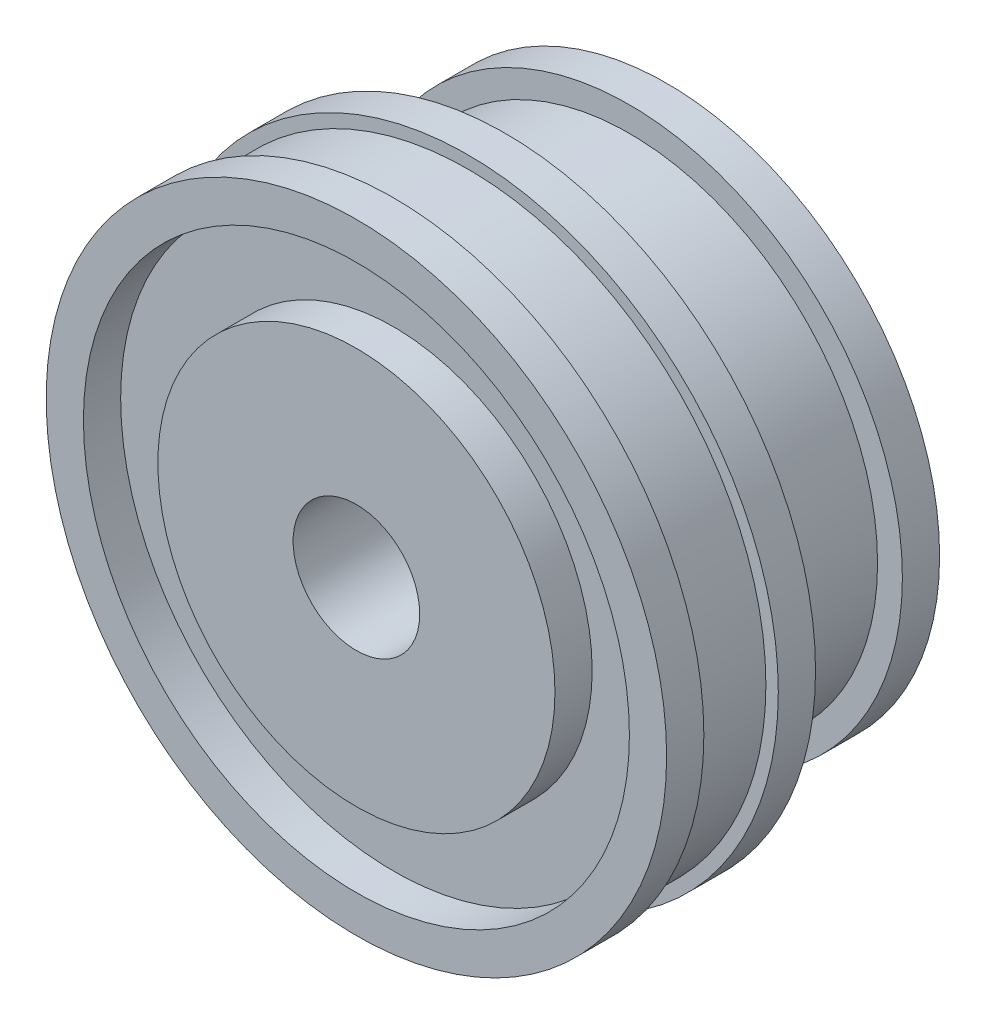
ISO-10303-21;
HEADER;
FILE_DESCRIPTION(('STEP AP214'),'2;1');
FILE_NAME('part.step','',(''),(''),'','','');
FILE_SCHEMA(('AUTOMOTIVE_DESIGN { 1 0 10303 214 1 1 1 1 }'));
ENDSEC;
DATA;
#1=APPLICATION_CONTEXT('core data for automotive mechanical design processes');
#2=APPLICATION_PROTOCOL_DEFINITION('international standard','automotive_design',2000,#1);
#3=PRODUCT_CONTEXT('',#1,'mechanical');
#4=PRODUCT('Part','Part','',(#3));
#5=PRODUCT_RELATED_PRODUCT_CATEGORY('part','',(#4));
#6=PRODUCT_DEFINITION_FORMATION('','',#4);
#7=PRODUCT_DEFINITION_CONTEXT('part definition',#1,'design');
#8=PRODUCT_DEFINITION('design','',#6,#7);
#9=PRODUCT_DEFINITION_SHAPE('','',#8);
#10=(LENGTH_UNIT() NAMED_UNIT(*) SI_UNIT(.MILLI.,.METRE.));
#11=(NAMED_UNIT(*) PLANE_ANGLE_UNIT() SI_UNIT($,.RADIAN.));
#12=(NAMED_UNIT(*) SI_UNIT($,.STERADIAN.) SOLID_ANGLE_UNIT());
#13=UNCERTAINTY_MEASURE_WITH_UNIT(LENGTH_MEASURE(1.E-05),#10,'distance_accuracy_value','');
#14=(GEOMETRIC_REPRESENTATION_CONTEXT(3) GLOBAL_UNCERTAINTY_ASSIGNED_CONTEXT((#13)) GLOBAL_UNIT_ASSIGNED_CONTEXT((#10,
#11,#12)) REPRESENTATION_CONTEXT('',''));
#15=CARTESIAN_POINT('',(0.,0.,0.));
#16=DIRECTION('',(0.,0.,1.));
#17=DIRECTION('',(1.,0.,0.));
#18=AXIS2_PLACEMENT_3D('',#15,#16,#17);
#19=CARTESIAN_POINT('',(0.,0.,6.));
#20=DIRECTION('',(0.,0.,-1.));
#21=DIRECTION('',(-1.,0.,0.));
#22=AXIS2_PLACEMENT_3D('',#19,#20,#21);
#23=CYLINDRICAL_SURFACE('',#22,7.);
#24=CARTESIAN_POINT('',(0.,0.,6.));
#25=DIRECTION('',(0.,0.,1.));
#26=DIRECTION('',(1.,0.,0.));
#27=AXIS2_PLACEMENT_3D('',#24,#25,#26);
#28=CIRCLE('',#27,7.);
#29=CARTESIAN_POINT('',(7.00000000000001,0.,6.));
#30=VERTEX_POINT('',#29);
#31=EDGE_CURVE('E81',#30,#30,#28,.T.);
#32=ORIENTED_EDGE('',*,*,#31,.T.);
#33=EDGE_LOOP('',(#32));
#34=FACE_BOUND('',#33,.T.);
#35=CARTESIAN_POINT('',(0.,0.,4.));
#36=DIRECTION('',(0.,0.,1.));
#37=DIRECTION('',(1.,0.,0.));
#38=AXIS2_PLACEMENT_3D('',#35,#36,#37);
#39=CIRCLE('',#38,7.);
#40=CARTESIAN_POINT('',(7.00000000000001,0.,4.));
#41=VERTEX_POINT('',#40);
#42=EDGE_CURVE('E86',#41,#41,#39,.T.);
#43=ORIENTED_EDGE('',*,*,#42,.F.);
#44=EDGE_LOOP('',(#43));
#45=FACE_BOUND('',#44,.T.);
#46=ADVANCED_FACE('F39',(#34,#45),#23,.F.);
#47=CARTESIAN_POINT('',(0.,0.,6.));
#48=DIRECTION('',(0.,0.,1.));
#49=DIRECTION('',(1.,0.,0.));
#50=AXIS2_PLACEMENT_3D('',#47,#48,#49);
#51=PLANE('',#50);
#52=CARTESIAN_POINT('',(0.,0.,6.00000000000001));
#53=DIRECTION('',(0.,0.,1.));
#54=DIRECTION('',(1.,0.,0.));
#55=AXIS2_PLACEMENT_3D('',#52,#53,#54);
#56=CIRCLE('',#55,5.09999999999999);
#57=CARTESIAN_POINT('',(5.1,0.,6.00000000000001));
#58=VERTEX_POINT('',#57);
#59=EDGE_CURVE('E93',#58,#58,#56,.T.);
#60=ORIENTED_EDGE('',*,*,#59,.T.);
#61=EDGE_LOOP('',(#60));
#62=FACE_BOUND('',#61,.T.);
#63=ORIENTED_EDGE('',*,*,#31,.F.);
#64=EDGE_LOOP('',(#63));
#65=FACE_BOUND('',#64,.T.);
#66=ADVANCED_FACE('F125',(#62,#65),#51,.F.);
#67=CARTESIAN_POINT('',(0.,0.,4.));
#68=DIRECTION('',(0.,0.,1.));
#69=DIRECTION('',(1.,0.,0.));
#70=AXIS2_PLACEMENT_3D('',#67,#68,#69);
#71=PLANE('',#70);
#72=ORIENTED_EDGE('',*,*,#42,.T.);
#73=EDGE_LOOP('',(#72));
#74=FACE_BOUND('',#73,.T.);
#75=ADVANCED_FACE('F130',(#74),#71,.T.);
#76=CARTESIAN_POINT('',(0.,0.,25.));
#77=DIRECTION('',(0.,0.,1.));
#78=DIRECTION('',(1.,0.,0.));
#79=AXIS2_PLACEMENT_3D('',#76,#77,#78);
#80=CYLINDRICAL_SURFACE('',#79,5.09999999999999);
#81=ORIENTED_EDGE('',*,*,#59,.F.);
#82=EDGE_LOOP('',(#81));
#83=FACE_BOUND('',#82,.T.);
#84=CARTESIAN_POINT('',(0.,0.,25.));
#85=DIRECTION('',(0.,0.,1.));
#86=DIRECTION('',(1.,0.,0.));
#87=AXIS2_PLACEMENT_3D('',#84,#85,#86);
#88=CIRCLE('',#87,5.09999999999999);
#89=CARTESIAN_POINT('',(5.09999999999999,0.,25.));
#90=VERTEX_POINT('',#89);
#91=EDGE_CURVE('E96',#90,#90,#88,.T.);
#92=ORIENTED_EDGE('',*,*,#91,.T.);
#93=EDGE_LOOP('',(#92));
#94=FACE_BOUND('',#93,.T.);
#95=ADVANCED_FACE('F99',(#83,#94),#80,.F.);
#96=CARTESIAN_POINT('',(0.,0.,16.));
#97=DIRECTION('',(0.,0.,1.));
#98=DIRECTION('',(1.,0.,0.));
#99=AXIS2_PLACEMENT_3D('',#96,#97,#98);
#100=PLANE('',#99);
#101=CARTESIAN_POINT('',(0.,0.,16.));
#102=DIRECTION('',(0.,0.,1.));
#103=DIRECTION('',(1.,0.,0.));
#104=AXIS2_PLACEMENT_3D('',#101,#102,#103);
#105=CIRCLE('',#104,25.);
#106=CARTESIAN_POINT('',(25.,0.,16.));
#107=VERTEX_POINT('',#106);
#108=EDGE_CURVE('E54',#107,#107,#105,.T.);
#109=ORIENTED_EDGE('',*,*,#108,.T.);
#110=EDGE_LOOP('',(#109));
#111=FACE_BOUND('',#110,.T.);
#112=CARTESIAN_POINT('',(0.,0.,16.));
#113=DIRECTION('',(0.,0.,1.));
#114=DIRECTION('',(1.,0.,0.));
#115=AXIS2_PLACEMENT_3D('',#112,#113,#114);
#116=CIRCLE('',#115,24.);
#117=CARTESIAN_POINT('',(24.,0.,16.));
#118=VERTEX_POINT('',#117);
#119=EDGE_CURVE('E62',#118,#118,#116,.T.);
#120=ORIENTED_EDGE('',*,*,#119,.F.);
#121=EDGE_LOOP('',(#120));
#122=FACE_BOUND('',#121,.T.);
#123=ADVANCED_FACE('F137',(#111,#122),#100,.T.);
#124=CARTESIAN_POINT('',(0.,0.,3.));
#125=DIRECTION('',(0.,0.,1.));
#126=DIRECTION('',(1.,0.,0.));
#127=AXIS2_PLACEMENT_3D('',#124,#125,#126);
#128=PLANE('',#127);
#129=CARTESIAN_POINT('',(0.,0.,3.));
#130=DIRECTION('',(0.,0.,1.));
#131=DIRECTION('',(1.,0.,0.));
#132=AXIS2_PLACEMENT_3D('',#129,#130,#131);
#133=CIRCLE('',#132,22.);
#134=CARTESIAN_POINT('',(22.,0.,3.));
#135=VERTEX_POINT('',#134);
#136=EDGE_CURVE('E10',#135,#135,#133,.T.);
#137=ORIENTED_EDGE('',*,*,#136,.T.);
#138=EDGE_LOOP('',(#137));
#139=FACE_BOUND('',#138,.T.);
#140=CARTESIAN_POINT('',(0.,0.,3.));
#141=DIRECTION('',(0.,0.,1.));
#142=DIRECTION('',(1.,0.,0.));
#143=AXIS2_PLACEMENT_3D('',#140,#141,#142);
#144=CIRCLE('',#143,20.);
#145=CARTESIAN_POINT('',(20.,0.,3.));
#146=VERTEX_POINT('',#145);
#147=EDGE_CURVE('E55',#146,#146,#144,.T.);
#148=ORIENTED_EDGE('',*,*,#147,.F.);
#149=EDGE_LOOP('',(#148));
#150=FACE_BOUND('',#149,.T.);
#151=ADVANCED_FACE('F143',(#139,#150),#128,.T.);
#152=CARTESIAN_POINT('',(0.,0.,3.));
#153=DIRECTION('',(0.,0.,-1.));
#154=DIRECTION('',(-1.,0.,0.));
#155=AXIS2_PLACEMENT_3D('',#152,#153,#154);
#156=CYLINDRICAL_SURFACE('',#155,22.);
#157=ORIENTED_EDGE('',*,*,#136,.F.);
#158=EDGE_LOOP('',(#157));
#159=FACE_BOUND('',#158,.T.);
#160=CARTESIAN_POINT('',(0.,0.,0.));
#161=DIRECTION('',(0.,0.,1.));
#162=DIRECTION('',(1.,0.,0.));
#163=AXIS2_PLACEMENT_3D('',#160,#161,#162);
#164=CIRCLE('',#163,22.);
#165=CARTESIAN_POINT('',(22.,0.,0.));
#166=VERTEX_POINT('',#165);
#167=EDGE_CURVE('E43',#166,#166,#164,.T.);
#168=ORIENTED_EDGE('',*,*,#167,.T.);
#169=EDGE_LOOP('',(#168));
#170=FACE_BOUND('',#169,.T.);
#171=ADVANCED_FACE('F41',(#159,#170),#156,.T.);
#172=CARTESIAN_POINT('',(0.,0.,0.));
#173=DIRECTION('',(0.,0.,1.));
#174=DIRECTION('',(1.,0.,0.));
#175=AXIS2_PLACEMENT_3D('',#172,#173,#174);
#176=PLANE('',#175);
#177=ORIENTED_EDGE('',*,*,#167,.F.);
#178=EDGE_LOOP('',(#177));
#179=FACE_BOUND('',#178,.T.);
#180=ADVANCED_FACE('F167',(#179),#176,.F.);
#181=CARTESIAN_POINT('',(0.,0.,13.));
#182=DIRECTION('',(0.,0.,-1.));
#183=DIRECTION('',(-1.,0.,0.));
#184=AXIS2_PLACEMENT_3D('',#181,#182,#183);
#185=CYLINDRICAL_SURFACE('',#184,20.);
#186=CARTESIAN_POINT('',(0.,0.,13.));
#187=DIRECTION('',(0.,0.,1.));
#188=DIRECTION('',(1.,0.,0.));
#189=AXIS2_PLACEMENT_3D('',#186,#187,#188);
#190=CIRCLE('',#189,20.);
#191=CARTESIAN_POINT('',(20.,0.,13.));
#192=VERTEX_POINT('',#191);
#193=EDGE_CURVE('E49',#192,#192,#190,.T.);
#194=ORIENTED_EDGE('',*,*,#193,.F.);
#195=EDGE_LOOP('',(#194));
#196=FACE_BOUND('',#195,.T.);
#197=ORIENTED_EDGE('',*,*,#147,.T.);
#198=EDGE_LOOP('',(#197));
#199=FACE_BOUND('',#198,.T.);
#200=ADVANCED_FACE('F159',(#196,#199),#185,.T.);
#201=CARTESIAN_POINT('',(0.,0.,13.));
#202=DIRECTION('',(0.,0.,1.));
#203=DIRECTION('',(1.,0.,0.));
#204=AXIS2_PLACEMENT_3D('',#201,#202,#203);
#205=PLANE('',#204);
#206=CARTESIAN_POINT('',(0.,0.,13.));
#207=DIRECTION('',(0.,0.,1.));
#208=DIRECTION('',(1.,0.,0.));
#209=AXIS2_PLACEMENT_3D('',#206,#207,#208);
#210=CIRCLE('',#209,25.);
#211=CARTESIAN_POINT('',(25.,0.,13.));
#212=VERTEX_POINT('',#211);
#213=EDGE_CURVE('E59',#212,#212,#210,.T.);
#214=ORIENTED_EDGE('',*,*,#213,.F.);
#215=EDGE_LOOP('',(#214));
#216=FACE_BOUND('',#215,.T.);
#217=ORIENTED_EDGE('',*,*,#193,.T.);
#218=EDGE_LOOP('',(#217));
#219=FACE_BOUND('',#218,.T.);
#220=ADVANCED_FACE('F156',(#216,#219),#205,.F.);
#221=CARTESIAN_POINT('',(0.,0.,16.));
#222=DIRECTION('',(0.,0.,-1.));
#223=DIRECTION('',(-1.,0.,0.));
#224=AXIS2_PLACEMENT_3D('',#221,#222,#223);
#225=CYLINDRICAL_SURFACE('',#224,25.);
#226=ORIENTED_EDGE('',*,*,#108,.F.);
#227=EDGE_LOOP('',(#226));
#228=FACE_BOUND('',#227,.T.);
#229=ORIENTED_EDGE('',*,*,#213,.T.);
#230=EDGE_LOOP('',(#229));
#231=FACE_BOUND('',#230,.T.);
#232=ADVANCED_FACE('F157',(#228,#231),#225,.T.);
#233=CARTESIAN_POINT('',(0.,0.,22.));
#234=DIRECTION('',(0.,0.,-1.));
#235=DIRECTION('',(-1.,0.,0.));
#236=AXIS2_PLACEMENT_3D('',#233,#234,#235);
#237=CYLINDRICAL_SURFACE('',#236,24.);
#238=CARTESIAN_POINT('',(0.,0.,22.));
#239=DIRECTION('',(0.,0.,1.));
#240=DIRECTION('',(1.,0.,0.));
#241=AXIS2_PLACEMENT_3D('',#238,#239,#240);
#242=CIRCLE('',#241,24.);
#243=CARTESIAN_POINT('',(24.,0.,22.));
#244=VERTEX_POINT('',#243);
#245=EDGE_CURVE('E63',#244,#244,#242,.T.);
#246=ORIENTED_EDGE('',*,*,#245,.F.);
#247=EDGE_LOOP('',(#246));
#248=FACE_BOUND('',#247,.T.);
#249=ORIENTED_EDGE('',*,*,#119,.T.);
#250=EDGE_LOOP('',(#249));
#251=FACE_BOUND('',#250,.T.);
#252=ADVANCED_FACE('F152',(#248,#251),#237,.T.);
#253=CARTESIAN_POINT('',(0.,0.,22.));
#254=DIRECTION('',(0.,0.,1.));
#255=DIRECTION('',(1.,0.,0.));
#256=AXIS2_PLACEMENT_3D('',#253,#254,#255);
#257=PLANE('',#256);
#258=CARTESIAN_POINT('',(0.,0.,22.));
#259=DIRECTION('',(0.,0.,1.));
#260=DIRECTION('',(1.,0.,0.));
#261=AXIS2_PLACEMENT_3D('',#258,#259,#260);
#262=CIRCLE('',#261,25.);
#263=CARTESIAN_POINT('',(25.,0.,22.));
#264=VERTEX_POINT('',#263);
#265=EDGE_CURVE('E69',#264,#264,#262,.T.);
#266=ORIENTED_EDGE('',*,*,#265,.F.);
#267=EDGE_LOOP('',(#266));
#268=FACE_BOUND('',#267,.T.);
#269=ORIENTED_EDGE('',*,*,#245,.T.);
#270=EDGE_LOOP('',(#269));
#271=FACE_BOUND('',#270,.T.);
#272=ADVANCED_FACE('F202',(#268,#271),#257,.F.);
#273=CARTESIAN_POINT('',(0.,0.,25.));
#274=DIRECTION('',(0.,0.,-1.));
#275=DIRECTION('',(-1.,0.,0.));
#276=AXIS2_PLACEMENT_3D('',#273,#274,#275);
#277=CYLINDRICAL_SURFACE('',#276,25.);
#278=CARTESIAN_POINT('',(0.,0.,25.));
#279=DIRECTION('',(0.,0.,1.));
#280=DIRECTION('',(1.,0.,0.));
#281=AXIS2_PLACEMENT_3D('',#278,#279,#280);
#282=CIRCLE('',#281,25.);
#283=CARTESIAN_POINT('',(25.,0.,25.));
#284=VERTEX_POINT('',#283);
#285=EDGE_CURVE('E70',#284,#284,#282,.T.);
#286=ORIENTED_EDGE('',*,*,#285,.F.);
#287=EDGE_LOOP('',(#286));
#288=FACE_BOUND('',#287,.T.);
#289=ORIENTED_EDGE('',*,*,#265,.T.);
#290=EDGE_LOOP('',(#289));
#291=FACE_BOUND('',#290,.T.);
#292=ADVANCED_FACE('F215',(#288,#291),#277,.T.);
#293=CARTESIAN_POINT('',(0.,0.,25.));
#294=DIRECTION('',(0.,0.,1.));
#295=DIRECTION('',(1.,0.,0.));
#296=AXIS2_PLACEMENT_3D('',#293,#294,#295);
#297=PLANE('',#296);
#298=CARTESIAN_POINT('',(0.,0.,25.));
#299=DIRECTION('',(0.,0.,1.));
#300=DIRECTION('',(1.,0.,0.));
#301=AXIS2_PLACEMENT_3D('',#298,#299,#300);
#302=CIRCLE('',#301,22.);
#303=CARTESIAN_POINT('',(22.,0.,25.));
#304=VERTEX_POINT('',#303);
#305=EDGE_CURVE('E77',#304,#304,#302,.T.);
#306=ORIENTED_EDGE('',*,*,#305,.F.);
#307=EDGE_LOOP('',(#306));
#308=FACE_BOUND('',#307,.T.);
#309=ORIENTED_EDGE('',*,*,#285,.T.);
#310=EDGE_LOOP('',(#309));
#311=FACE_BOUND('',#310,.T.);
#312=ADVANCED_FACE('F110',(#308,#311),#297,.T.);
#313=CARTESIAN_POINT('',(0.,0.,22.));
#314=DIRECTION('',(0.,0.,1.));
#315=DIRECTION('',(1.,0.,0.));
#316=AXIS2_PLACEMENT_3D('',#313,#314,#315);
#317=CYLINDRICAL_SURFACE('',#316,22.);
#318=CARTESIAN_POINT('',(0.,0.,22.));
#319=DIRECTION('',(0.,0.,1.));
#320=DIRECTION('',(1.,0.,0.));
#321=AXIS2_PLACEMENT_3D('',#318,#319,#320);
#322=CIRCLE('',#321,22.);
#323=CARTESIAN_POINT('',(22.,0.,22.));
#324=VERTEX_POINT('',#323);
#325=EDGE_CURVE('E71',#324,#324,#322,.T.);
#326=ORIENTED_EDGE('',*,*,#325,.F.);
#327=EDGE_LOOP('',(#326));
#328=FACE_BOUND('',#327,.T.);
#329=ORIENTED_EDGE('',*,*,#305,.T.);
#330=EDGE_LOOP('',(#329));
#331=FACE_BOUND('',#330,.T.);
#332=ADVANCED_FACE('F120',(#328,#331),#317,.F.);
#333=CARTESIAN_POINT('',(0.,0.,22.));
#334=DIRECTION('',(0.,0.,1.));
#335=DIRECTION('',(1.,0.,0.));
#336=AXIS2_PLACEMENT_3D('',#333,#334,#335);
#337=PLANE('',#336);
#338=CARTESIAN_POINT('',(0.,0.,22.));
#339=DIRECTION('',(0.,0.,1.));
#340=DIRECTION('',(1.,0.,0.));
#341=AXIS2_PLACEMENT_3D('',#338,#339,#340);
#342=CIRCLE('',#341,16.);
#343=CARTESIAN_POINT('',(16.,0.,22.));
#344=VERTEX_POINT('',#343);
#345=EDGE_CURVE('E76',#344,#344,#342,.T.);
#346=ORIENTED_EDGE('',*,*,#345,.F.);
#347=EDGE_LOOP('',(#346));
#348=FACE_BOUND('',#347,.T.);
#349=ORIENTED_EDGE('',*,*,#325,.T.);
#350=EDGE_LOOP('',(#349));
#351=FACE_BOUND('',#350,.T.);
#352=ADVANCED_FACE('F112',(#348,#351),#337,.T.);
#353=CARTESIAN_POINT('',(0.,0.,22.));
#354=DIRECTION('',(0.,0.,1.));
#355=DIRECTION('',(1.,0.,0.));
#356=AXIS2_PLACEMENT_3D('',#353,#354,#355);
#357=CYLINDRICAL_SURFACE('',#356,16.);
#358=ORIENTED_EDGE('',*,*,#345,.T.);
#359=EDGE_LOOP('',(#358));
#360=FACE_BOUND('',#359,.T.);
#361=CARTESIAN_POINT('',(0.,0.,25.));
#362=DIRECTION('',(0.,0.,1.));
#363=DIRECTION('',(1.,0.,0.));
#364=AXIS2_PLACEMENT_3D('',#361,#362,#363);
#365=CIRCLE('',#364,16.);
#366=CARTESIAN_POINT('',(16.,0.,25.));
#367=VERTEX_POINT('',#366);
#368=EDGE_CURVE('E85',#367,#367,#365,.T.);
#369=ORIENTED_EDGE('',*,*,#368,.F.);
#370=EDGE_LOOP('',(#369));
#371=FACE_BOUND('',#370,.T.);
#372=ADVANCED_FACE('F104',(#360,#371),#357,.T.);
#373=ORIENTED_EDGE('',*,*,#91,.F.);
#374=EDGE_LOOP('',(#373));
#375=FACE_BOUND('',#374,.T.);
#376=ORIENTED_EDGE('',*,*,#368,.T.);
#377=EDGE_LOOP('',(#376));
#378=FACE_BOUND('',#377,.T.);
#379=ADVANCED_FACE('F105',(#375,#378),#297,.T.);
#380=CLOSED_SHELL('',(#46,#66,#75,#95,#123,#151,#171,#180,#200,#220,#232,#252,#272,#292,#312,
#332,#352,#372,#379));
#381=MANIFOLD_SOLID_BREP('B2',#380);
#382=ADVANCED_BREP_SHAPE_REPRESENTATION('',(#18,#381),#14);
#383=SHAPE_DEFINITION_REPRESENTATION(#9,#382);
ENDSEC;
END-ISO-10303-21;
